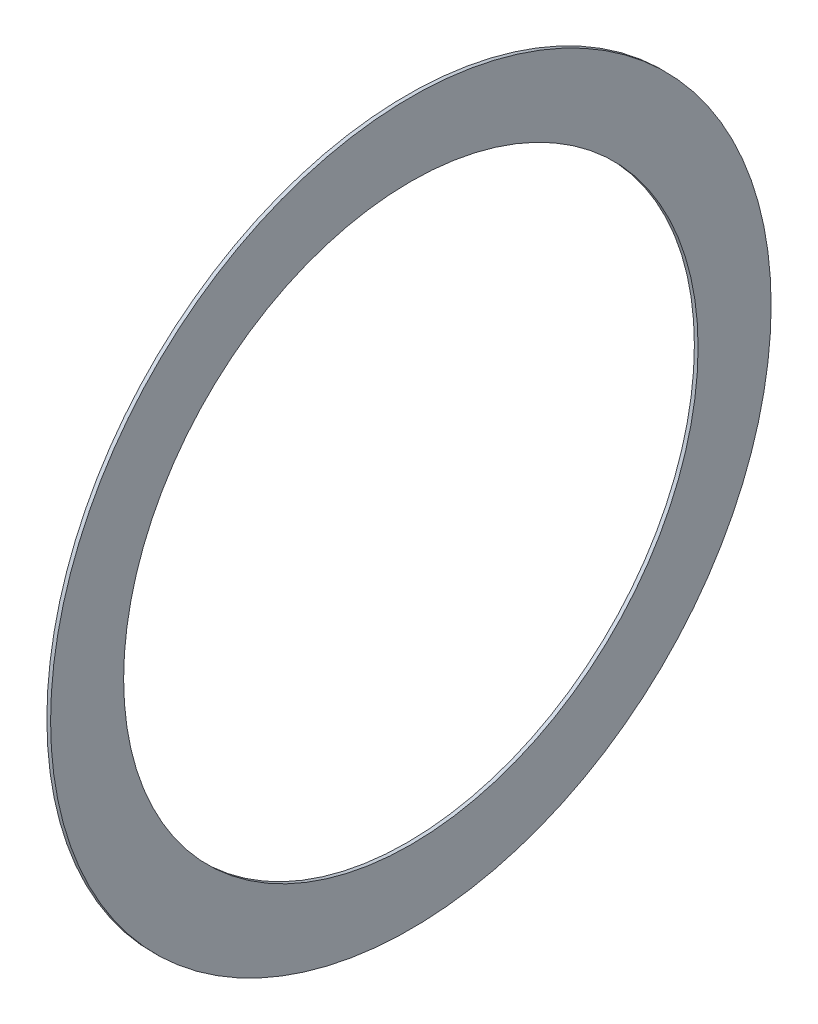
ISO-10303-21;
HEADER;
FILE_DESCRIPTION(('STEP AP214'),'2;1');
FILE_NAME('part.step','',(''),(''),'','','');
FILE_SCHEMA(('AUTOMOTIVE_DESIGN { 1 0 10303 214 1 1 1 1 }'));
ENDSEC;
DATA;
#1=APPLICATION_CONTEXT('core data for automotive mechanical design processes');
#2=APPLICATION_PROTOCOL_DEFINITION('international standard','automotive_design',2000,#1);
#3=PRODUCT_CONTEXT('',#1,'mechanical');
#4=PRODUCT('Part','Part','',(#3));
#5=PRODUCT_RELATED_PRODUCT_CATEGORY('part','',(#4));
#6=PRODUCT_DEFINITION_FORMATION('','',#4);
#7=PRODUCT_DEFINITION_CONTEXT('part definition',#1,'design');
#8=PRODUCT_DEFINITION('design','',#6,#7);
#9=PRODUCT_DEFINITION_SHAPE('','',#8);
#10=(LENGTH_UNIT() NAMED_UNIT(*) SI_UNIT(.MILLI.,.METRE.));
#11=(NAMED_UNIT(*) PLANE_ANGLE_UNIT() SI_UNIT($,.RADIAN.));
#12=(NAMED_UNIT(*) SI_UNIT($,.STERADIAN.) SOLID_ANGLE_UNIT());
#13=UNCERTAINTY_MEASURE_WITH_UNIT(LENGTH_MEASURE(1.E-05),#10,'distance_accuracy_value','');
#14=(GEOMETRIC_REPRESENTATION_CONTEXT(3) GLOBAL_UNCERTAINTY_ASSIGNED_CONTEXT((#13)) GLOBAL_UNIT_ASSIGNED_CONTEXT((#10,
#11,#12)) REPRESENTATION_CONTEXT('',''));
#15=CARTESIAN_POINT('',(0.,0.,0.));
#16=DIRECTION('',(0.,0.,1.));
#17=DIRECTION('',(1.,0.,0.));
#18=AXIS2_PLACEMENT_3D('',#15,#16,#17);
#19=CARTESIAN_POINT('',(0.15,11.6,0.));
#20=DIRECTION('',(1.,0.,0.));
#21=DIRECTION('',(0.,1.,0.));
#22=AXIS2_PLACEMENT_3D('',#19,#20,#21);
#23=PLANE('',#22);
#24=CARTESIAN_POINT('',(0.15,0.,0.));
#25=DIRECTION('',(1.,0.,0.));
#26=DIRECTION('',(0.,0.,-1.));
#27=AXIS2_PLACEMENT_3D('',#24,#25,#26);
#28=CIRCLE('',#27,11.6);
#29=CARTESIAN_POINT('',(0.15,0.,-11.6));
#30=VERTEX_POINT('',#29);
#31=EDGE_CURVE('E10',#30,#30,#28,.T.);
#32=ORIENTED_EDGE('',*,*,#31,.F.);
#33=EDGE_LOOP('',(#32));
#34=FACE_BOUND('',#33,.T.);
#35=CARTESIAN_POINT('',(0.15,0.,0.));
#36=DIRECTION('',(1.,0.,0.));
#37=DIRECTION('',(0.,0.,-1.));
#38=AXIS2_PLACEMENT_3D('',#35,#36,#37);
#39=CIRCLE('',#38,14.55);
#40=CARTESIAN_POINT('',(0.15,0.,-14.55));
#41=VERTEX_POINT('',#40);
#42=EDGE_CURVE('E28',#41,#41,#39,.T.);
#43=ORIENTED_EDGE('',*,*,#42,.T.);
#44=EDGE_LOOP('',(#43));
#45=FACE_BOUND('',#44,.T.);
#46=ADVANCED_FACE('F14',(#34,#45),#23,.T.);
#47=CARTESIAN_POINT('',(0.15,0.,0.));
#48=DIRECTION('',(1.,0.,0.));
#49=DIRECTION('',(0.,0.,-1.));
#50=AXIS2_PLACEMENT_3D('',#47,#48,#49);
#51=CYLINDRICAL_SURFACE('',#50,11.6);
#52=CARTESIAN_POINT('',(0.,0.,0.));
#53=DIRECTION('',(1.,0.,0.));
#54=DIRECTION('',(0.,0.,-1.));
#55=AXIS2_PLACEMENT_3D('',#52,#53,#54);
#56=CIRCLE('',#55,11.6);
#57=CARTESIAN_POINT('',(0.,0.,-11.6));
#58=VERTEX_POINT('',#57);
#59=EDGE_CURVE('E22',#58,#58,#56,.T.);
#60=ORIENTED_EDGE('',*,*,#59,.F.);
#61=EDGE_LOOP('',(#60));
#62=FACE_BOUND('',#61,.T.);
#63=ORIENTED_EDGE('',*,*,#31,.T.);
#64=EDGE_LOOP('',(#63));
#65=FACE_BOUND('',#64,.T.);
#66=ADVANCED_FACE('F16',(#62,#65),#51,.F.);
#67=CARTESIAN_POINT('',(0.,14.55,0.));
#68=DIRECTION('',(-1.,0.,0.));
#69=DIRECTION('',(0.,0.,1.));
#70=AXIS2_PLACEMENT_3D('',#67,#68,#69);
#71=PLANE('',#70);
#72=CARTESIAN_POINT('',(0.,0.,0.));
#73=DIRECTION('',(1.,0.,0.));
#74=DIRECTION('',(0.,0.,-1.));
#75=AXIS2_PLACEMENT_3D('',#72,#73,#74);
#76=CIRCLE('',#75,14.55);
#77=CARTESIAN_POINT('',(0.,0.,-14.55));
#78=VERTEX_POINT('',#77);
#79=EDGE_CURVE('E38',#78,#78,#76,.T.);
#80=ORIENTED_EDGE('',*,*,#79,.F.);
#81=EDGE_LOOP('',(#80));
#82=FACE_BOUND('',#81,.T.);
#83=ORIENTED_EDGE('',*,*,#59,.T.);
#84=EDGE_LOOP('',(#83));
#85=FACE_BOUND('',#84,.T.);
#86=ADVANCED_FACE('F46',(#82,#85),#71,.T.);
#87=CARTESIAN_POINT('',(0.15,0.,0.));
#88=DIRECTION('',(1.,0.,0.));
#89=DIRECTION('',(0.,0.,-1.));
#90=AXIS2_PLACEMENT_3D('',#87,#88,#89);
#91=CYLINDRICAL_SURFACE('',#90,14.55);
#92=ORIENTED_EDGE('',*,*,#42,.F.);
#93=EDGE_LOOP('',(#92));
#94=FACE_BOUND('',#93,.T.);
#95=ORIENTED_EDGE('',*,*,#79,.T.);
#96=EDGE_LOOP('',(#95));
#97=FACE_BOUND('',#96,.T.);
#98=ADVANCED_FACE('F42',(#94,#97),#91,.T.);
#99=CLOSED_SHELL('',(#46,#66,#86,#98));
#100=MANIFOLD_SOLID_BREP('B1',#99);
#101=ADVANCED_BREP_SHAPE_REPRESENTATION('',(#18,#100),#14);
#102=SHAPE_DEFINITION_REPRESENTATION(#9,#101);
ENDSEC;
END-ISO-10303-21;
